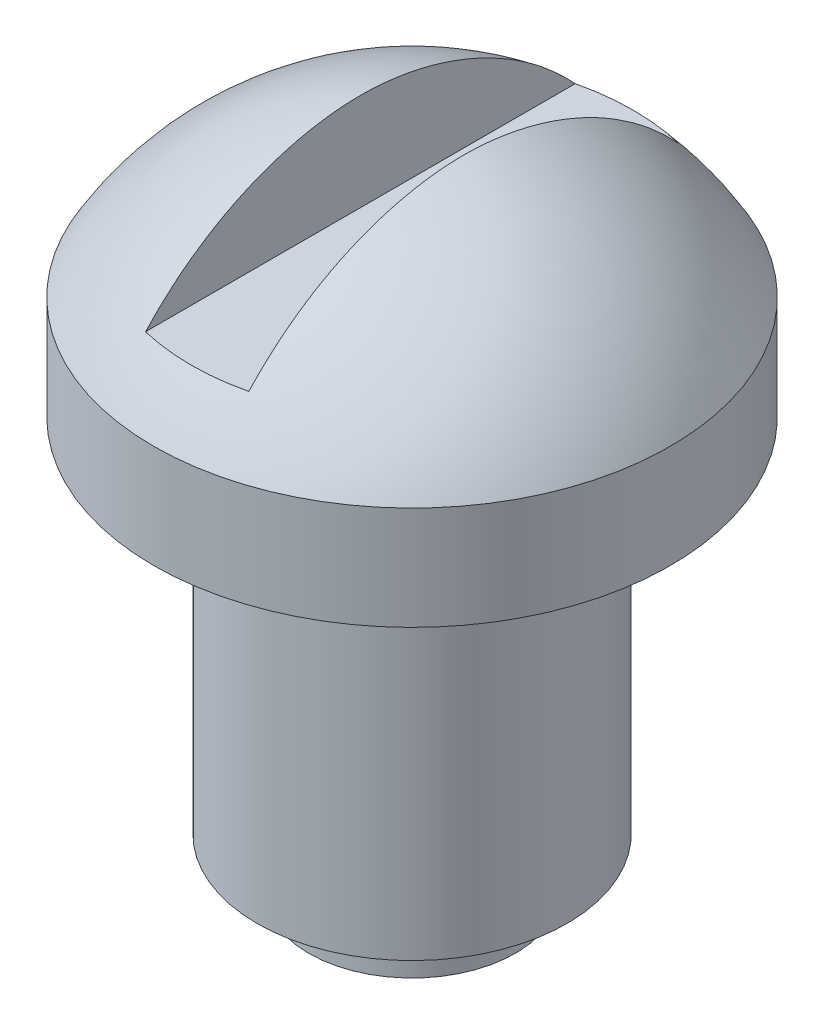
ISO-10303-21;
HEADER;
FILE_DESCRIPTION(('STEP AP214'),'2;1');
FILE_NAME('part.step','',(''),(''),'','','');
FILE_SCHEMA(('AUTOMOTIVE_DESIGN { 1 0 10303 214 1 1 1 1 }'));
ENDSEC;
DATA;
#1=APPLICATION_CONTEXT('core data for automotive mechanical design processes');
#2=APPLICATION_PROTOCOL_DEFINITION('international standard','automotive_design',2000,#1);
#3=PRODUCT_CONTEXT('',#1,'mechanical');
#4=PRODUCT('Part','Part','',(#3));
#5=PRODUCT_RELATED_PRODUCT_CATEGORY('part','',(#4));
#6=PRODUCT_DEFINITION_FORMATION('','',#4);
#7=PRODUCT_DEFINITION_CONTEXT('part definition',#1,'design');
#8=PRODUCT_DEFINITION('design','',#6,#7);
#9=PRODUCT_DEFINITION_SHAPE('','',#8);
#10=(LENGTH_UNIT() NAMED_UNIT(*) SI_UNIT(.MILLI.,.METRE.));
#11=(NAMED_UNIT(*) PLANE_ANGLE_UNIT() SI_UNIT($,.RADIAN.));
#12=(NAMED_UNIT(*) SI_UNIT($,.STERADIAN.) SOLID_ANGLE_UNIT());
#13=UNCERTAINTY_MEASURE_WITH_UNIT(LENGTH_MEASURE(1.E-05),#10,'distance_accuracy_value','');
#14=(GEOMETRIC_REPRESENTATION_CONTEXT(3) GLOBAL_UNCERTAINTY_ASSIGNED_CONTEXT((#13)) GLOBAL_UNIT_ASSIGNED_CONTEXT((#10,
#11,#12)) REPRESENTATION_CONTEXT('',''));
#15=CARTESIAN_POINT('',(0.,0.,0.));
#16=DIRECTION('',(0.,0.,1.));
#17=DIRECTION('',(1.,0.,0.));
#18=AXIS2_PLACEMENT_3D('',#15,#16,#17);
#19=CARTESIAN_POINT('',(0.,-64.4842064058548,0.));
#20=DIRECTION('',(0.,1.,0.));
#21=DIRECTION('',(0.,0.,1.));
#22=AXIS2_PLACEMENT_3D('',#19,#20,#21);
#23=PLANE('',#22);
#24=CARTESIAN_POINT('',(0.,-64.4842064058548,0.));
#25=DIRECTION('',(0.,1.,0.));
#26=DIRECTION('',(0.,0.,1.));
#27=AXIS2_PLACEMENT_3D('',#24,#25,#26);
#28=CIRCLE('',#27,2.00000000000002);
#29=CARTESIAN_POINT('',(0.,-64.4842064058548,2.00000000000002));
#30=VERTEX_POINT('',#29);
#31=EDGE_CURVE('E85',#30,#30,#28,.T.);
#32=ORIENTED_EDGE('',*,*,#31,.F.);
#33=EDGE_LOOP('',(#32));
#34=FACE_BOUND('',#33,.T.);
#35=ADVANCED_FACE('F41',(#34),#23,.F.);
#36=CARTESIAN_POINT('',(0.,49.9801599802218,0.));
#37=DIRECTION('',(0.,1.,0.));
#38=DIRECTION('',(0.,0.,1.));
#39=AXIS2_PLACEMENT_3D('',#36,#37,#38);
#40=CYLINDRICAL_SURFACE('',#39,2.00000000000001);
#41=CARTESIAN_POINT('',(0.,-63.4842064058548,0.));
#42=DIRECTION('',(0.,1.,0.));
#43=DIRECTION('',(0.,0.,1.));
#44=AXIS2_PLACEMENT_3D('',#41,#42,#43);
#45=CIRCLE('',#44,2.00000000000001);
#46=CARTESIAN_POINT('',(0.,-63.4842064058548,2.00000000000001));
#47=VERTEX_POINT('',#46);
#48=EDGE_CURVE('E115',#47,#47,#45,.T.);
#49=ORIENTED_EDGE('',*,*,#48,.F.);
#50=EDGE_LOOP('',(#49));
#51=FACE_BOUND('',#50,.T.);
#52=ORIENTED_EDGE('',*,*,#31,.T.);
#53=EDGE_LOOP('',(#52));
#54=FACE_BOUND('',#53,.T.);
#55=ADVANCED_FACE('F105',(#51,#54),#40,.T.);
#56=CARTESIAN_POINT('',(2.00000000000002,-63.4842064058548,0.));
#57=DIRECTION('',(0.,1.,0.));
#58=DIRECTION('',(0.,0.,1.));
#59=AXIS2_PLACEMENT_3D('',#56,#57,#58);
#60=PLANE('',#59);
#61=CARTESIAN_POINT('',(0.,-63.4842064058548,0.));
#62=DIRECTION('',(0.,1.,0.));
#63=DIRECTION('',(0.,0.,1.));
#64=AXIS2_PLACEMENT_3D('',#61,#62,#63);
#65=CIRCLE('',#64,3.00000000000001);
#66=CARTESIAN_POINT('',(0.,-63.4842064058548,3.00000000000001));
#67=VERTEX_POINT('',#66);
#68=EDGE_CURVE('E117',#67,#67,#65,.T.);
#69=ORIENTED_EDGE('',*,*,#68,.F.);
#70=EDGE_LOOP('',(#69));
#71=FACE_BOUND('',#70,.T.);
#72=ORIENTED_EDGE('',*,*,#48,.T.);
#73=EDGE_LOOP('',(#72));
#74=FACE_BOUND('',#73,.T.);
#75=ADVANCED_FACE('F110',(#71,#74),#60,.F.);
#76=CARTESIAN_POINT('',(0.,49.9801599802218,0.));
#77=DIRECTION('',(0.,1.,0.));
#78=DIRECTION('',(0.,0.,1.));
#79=AXIS2_PLACEMENT_3D('',#76,#77,#78);
#80=CYLINDRICAL_SURFACE('',#79,3.00000000000001);
#81=CARTESIAN_POINT('',(0.,-56.4842064058548,0.));
#82=DIRECTION('',(0.,1.,0.));
#83=DIRECTION('',(0.,0.,1.));
#84=AXIS2_PLACEMENT_3D('',#81,#82,#83);
#85=CIRCLE('',#84,3.00000000000001);
#86=CARTESIAN_POINT('',(0.,-56.4842064058548,3.00000000000001));
#87=VERTEX_POINT('',#86);
#88=EDGE_CURVE('E122',#87,#87,#85,.T.);
#89=ORIENTED_EDGE('',*,*,#88,.F.);
#90=EDGE_LOOP('',(#89));
#91=FACE_BOUND('',#90,.T.);
#92=ORIENTED_EDGE('',*,*,#68,.T.);
#93=EDGE_LOOP('',(#92));
#94=FACE_BOUND('',#93,.T.);
#95=ADVANCED_FACE('F139',(#91,#94),#80,.T.);
#96=CARTESIAN_POINT('',(3.00000000000001,-56.4842064058548,0.));
#97=DIRECTION('',(0.,1.,0.));
#98=DIRECTION('',(0.,0.,1.));
#99=AXIS2_PLACEMENT_3D('',#96,#97,#98);
#100=PLANE('',#99);
#101=CARTESIAN_POINT('',(0.,-56.4842064058548,0.));
#102=DIRECTION('',(0.,1.,0.));
#103=DIRECTION('',(0.,0.,1.));
#104=AXIS2_PLACEMENT_3D('',#101,#102,#103);
#105=CIRCLE('',#104,5.00000000000001);
#106=CARTESIAN_POINT('',(0.,-56.4842064058548,5.00000000000001));
#107=VERTEX_POINT('',#106);
#108=EDGE_CURVE('E125',#107,#107,#105,.T.);
#109=ORIENTED_EDGE('',*,*,#108,.F.);
#110=EDGE_LOOP('',(#109));
#111=FACE_BOUND('',#110,.T.);
#112=ORIENTED_EDGE('',*,*,#88,.T.);
#113=EDGE_LOOP('',(#112));
#114=FACE_BOUND('',#113,.T.);
#115=ADVANCED_FACE('F134',(#111,#114),#100,.F.);
#116=CARTESIAN_POINT('',(0.,49.9801599802218,0.));
#117=DIRECTION('',(0.,1.,0.));
#118=DIRECTION('',(0.,0.,1.));
#119=AXIS2_PLACEMENT_3D('',#116,#117,#118);
#120=CYLINDRICAL_SURFACE('',#119,5.00000000000001);
#121=CARTESIAN_POINT('',(0.,-54.4842064058548,0.));
#122=DIRECTION('',(0.,1.,0.));
#123=DIRECTION('',(0.,0.,1.));
#124=AXIS2_PLACEMENT_3D('',#121,#122,#123);
#125=CIRCLE('',#124,5.00000000000001);
#126=CARTESIAN_POINT('',(0.,-54.4842064058548,5.00000000000001));
#127=VERTEX_POINT('',#126);
#128=EDGE_CURVE('E81',#127,#127,#125,.T.);
#129=ORIENTED_EDGE('',*,*,#128,.F.);
#130=EDGE_LOOP('',(#129));
#131=FACE_BOUND('',#130,.T.);
#132=ORIENTED_EDGE('',*,*,#108,.T.);
#133=EDGE_LOOP('',(#132));
#134=FACE_BOUND('',#133,.T.);
#135=ADVANCED_FACE('F103',(#131,#134),#120,.T.);
#136=CARTESIAN_POINT('',(0.,-57.4809372445079,0.));
#137=DIRECTION('',(0.,1.,0.));
#138=DIRECTION('',(0.,0.,1.));
#139=AXIS2_PLACEMENT_3D('',#136,#137,#138);
#140=DEGENERATE_TOROIDAL_SURFACE('',#139,0.198038503191875,6.,.F.);
#141=CARTESIAN_POINT('',(1.00000000000001,-51.6017618138144,0.));
#142=CARTESIAN_POINT('',(1.00000000000001,-51.6017620033345,0.084715214042042));
#143=CARTESIAN_POINT('',(1.00000000000001,-51.6039620872374,0.169431367941145));
#144=CARTESIAN_POINT('',(1.00000000000001,-51.6126852032767,0.338635647219892));
#145=CARTESIAN_POINT('',(1.00000000000001,-51.6192084272891,0.42312376231126));
#146=CARTESIAN_POINT('',(1.00000000000001,-51.6450022133793,0.67604980028602));
#147=CARTESIAN_POINT('',(1.00000000000001,-51.6704966630048,0.843886011122747));
#148=CARTESIAN_POINT('',(1.00000000000001,-51.7349056765373,1.16718626016063));
#149=CARTESIAN_POINT('',(1.00000000000001,-51.7729928715949,1.32281841748707));
#150=CARTESIAN_POINT('',(1.00000000000001,-51.8620798150541,1.63036838562201));
#151=CARTESIAN_POINT('',(1.00000000000001,-51.9130845178093,1.78228474671147));
#152=CARTESIAN_POINT('',(1.00000000000001,-52.0848335481229,2.23126062415455));
#153=CARTESIAN_POINT('',(1.00000000000001,-52.2242831377964,2.52140116258975));
#154=CARTESIAN_POINT('',(1.00000000000001,-52.5502586771165,3.07783725306508));
#155=CARTESIAN_POINT('',(1.00000000000001,-52.7372668679111,3.34384819548251));
#156=CARTESIAN_POINT('',(1.00000000000001,-53.1523458725852,3.84147886178625));
#157=CARTESIAN_POINT('',(1.00000000000001,-53.3803994449123,4.07311295177832));
#158=CARTESIAN_POINT('',(1.00000000000001,-53.8768780497599,4.50058698561096));
#159=CARTESIAN_POINT('',(1.00000000000002,-54.1460900749164,4.69551335069735));
#160=CARTESIAN_POINT('',(1.00000000000002,-54.7134087000799,5.0375714062977));
#161=CARTESIAN_POINT('',(1.00000000000001,-55.0115207319416,5.18469408924571));
#162=CARTESIAN_POINT('',(1.00000000000001,-55.6289031075391,5.42727476010327));
#163=CARTESIAN_POINT('',(1.00000000000002,-55.9482251905062,5.52260078282719));
#164=CARTESIAN_POINT('',(1.00000000000002,-56.5985012543226,5.65830273067935));
#165=CARTESIAN_POINT('',(1.00000000000001,-56.9294546989123,5.69868118574451));
#166=CARTESIAN_POINT('',(1.00000000000001,-57.427217243753,5.71723650726338));
#167=CARTESIAN_POINT('',(1.00000000000002,-57.5934987684865,5.71640136190316));
#168=CARTESIAN_POINT('',(1.00000000000002,-57.9253847543706,5.70073557668872));
#169=CARTESIAN_POINT('',(1.00000000000002,-58.0909894424208,5.68591009381828));
#170=CARTESIAN_POINT('',(1.00000000000002,-58.4204197928397,5.64235342682744));
#171=CARTESIAN_POINT('',(1.00000000000002,-58.5842446688328,5.61361633273106));
#172=CARTESIAN_POINT('',(1.00000000000002,-58.9088337443682,5.54245436998294));
#173=CARTESIAN_POINT('',(1.00000000000001,-59.0695990518467,5.50003456001177));
#174=CARTESIAN_POINT('',(1.00000000000001,-59.387058630741,5.4017806215291));
#175=CARTESIAN_POINT('',(1.00000000000002,-59.5437509624108,5.34594022665816));
#176=CARTESIAN_POINT('',(1.00000000000002,-59.8518149871753,5.22127480980668));
#177=CARTESIAN_POINT('',(1.00000000000002,-60.0031886251116,5.15245459391785));
#178=CARTESIAN_POINT('',(1.00000000000002,-60.2996334318136,5.00228575249587));
#179=CARTESIAN_POINT('',(1.00000000000002,-60.4447031072029,4.92093417886931));
#180=CARTESIAN_POINT('',(1.00000000000002,-60.7274155936637,4.74632325014781));
#181=CARTESIAN_POINT('',(1.00000000000001,-60.8650611351638,4.65306831590965));
#182=CARTESIAN_POINT('',(1.00000000000001,-61.1319911936666,4.45529471260292));
#183=CARTESIAN_POINT('',(1.00000000000002,-61.2612763457079,4.35077690065216));
#184=CARTESIAN_POINT('',(1.00000000000002,-61.5105263067453,4.13125199759025));
#185=CARTESIAN_POINT('',(1.00000000000002,-61.6304945569077,4.01624881366369));
#186=CARTESIAN_POINT('',(1.00000000000002,-61.8603792320019,3.7764534764499));
#187=CARTESIAN_POINT('',(1.00000000000002,-61.9702889631682,3.6516549056455));
#188=CARTESIAN_POINT('',(1.00000000000002,-62.1791326107265,3.39326595778808));
#189=CARTESIAN_POINT('',(1.00000000000001,-62.278070622081,3.25967889071631));
#190=CARTESIAN_POINT('',(1.00000000000001,-62.4641722763406,2.98479173829538));
#191=CARTESIAN_POINT('',(1.00000000000002,-62.5513509615506,2.84350183764221));
#192=CARTESIAN_POINT('',(1.00000000000002,-62.7133971287968,2.55409979674733));
#193=CARTESIAN_POINT('',(1.00000000000002,-62.7882693228116,2.40599029556921));
#194=CARTESIAN_POINT('',(1.00000000000002,-62.9251541758124,2.10391433004905));
#195=CARTESIAN_POINT('',(1.00000000000002,-62.9871648852885,1.94994698196975));
#196=CARTESIAN_POINT('',(1.00000000000002,-63.0977460255027,1.63722122251093));
#197=CARTESIAN_POINT('',(1.00000000000001,-63.1463141514324,1.47846199470478));
#198=CARTESIAN_POINT('',(1.00000000000001,-63.2290084018886,1.15867481923666));
#199=CARTESIAN_POINT('',(1.00000000000002,-63.2632547001506,0.997677964611161));
#200=CARTESIAN_POINT('',(1.00000000000002,-63.3169983056576,0.673232832934111));
#201=CARTESIAN_POINT('',(1.00000000000002,-63.3365003035741,0.509785352401461));
#202=CARTESIAN_POINT('',(1.00000000000002,-63.3537033509096,0.263902349028015));
#203=CARTESIAN_POINT('',(1.00000000000002,-63.3574303787634,0.181858872462155));
#204=CARTESIAN_POINT('',(1.00000000000002,-63.3607670673409,0.0176888281661727));
#205=CARTESIAN_POINT('',(1.00000000000002,-63.360376764804,-0.0644377388159857));
#206=CARTESIAN_POINT('',(1.00000000000002,-63.3530285662734,-0.310631746336618));
#207=CARTESIAN_POINT('',(1.00000000000001,-63.3398960307316,-0.474551187303378));
#208=CARTESIAN_POINT('',(1.00000000000001,-63.3007565972144,-0.781882296115757));
#209=CARTESIAN_POINT('',(1.00000000000002,-63.2763789343778,-0.925511188845437));
#210=CARTESIAN_POINT('',(1.00000000000002,-63.2164542721358,-1.21041404290608));
#211=CARTESIAN_POINT('',(1.00000000000002,-63.1809077418449,-1.3516881028823));
#212=CARTESIAN_POINT('',(1.00000000000002,-63.0990945589699,-1.63129077178507));
#213=CARTESIAN_POINT('',(1.00000000000002,-63.0528138910334,-1.76961526943501));
#214=CARTESIAN_POINT('',(1.00000000000002,-62.9499718467737,-2.04238346203414));
#215=CARTESIAN_POINT('',(1.00000000000001,-62.8934104444407,-2.17682714716407));
#216=CARTESIAN_POINT('',(1.00000000000001,-62.7648827921542,-2.45295167812796));
#217=CARTESIAN_POINT('',(1.00000000000002,-62.6919906030393,-2.59420244098579));
#218=CARTESIAN_POINT('',(1.00000000000002,-62.5349657048835,-2.87037584762266));
#219=CARTESIAN_POINT('',(1.00000000000002,-62.4508288180445,-3.00529611410714));
#220=CARTESIAN_POINT('',(1.00000000000002,-62.2719941515594,-3.26776765325747));
#221=CARTESIAN_POINT('',(1.00000000000002,-62.1773059957909,-3.39532548260354));
#222=CARTESIAN_POINT('',(1.00000000000002,-61.9779062220619,-3.6424253283467));
#223=CARTESIAN_POINT('',(1.00000000000001,-61.8731909083814,-3.76196436142887));
#224=CARTESIAN_POINT('',(1.00000000000001,-61.6500460155144,-3.9968469315779));
#225=CARTESIAN_POINT('',(1.00000000000002,-61.5312338489194,-4.11182732770429));
#226=CARTESIAN_POINT('',(1.00000000000002,-61.284339024931,-4.33145883799657));
#227=CARTESIAN_POINT('',(1.00000000000002,-61.1562528478043,-4.43610599442872));
#228=CARTESIAN_POINT('',(1.00000000000002,-60.8917545312829,-4.63429076865995));
#229=CARTESIAN_POINT('',(1.00000000000002,-60.7553423380975,-4.72782831467319));
#230=CARTESIAN_POINT('',(1.00000000000002,-60.4751045633243,-4.9031697876381));
#231=CARTESIAN_POINT('',(1.00000000000001,-60.3312762554568,-4.98496935711588));
#232=CARTESIAN_POINT('',(1.00000000000001,-60.0366988816172,-5.13651256223437));
#233=CARTESIAN_POINT('',(1.00000000000002,-59.8859252314416,-5.20620841466713));
#234=CARTESIAN_POINT('',(1.00000000000002,-59.5789906486952,-5.33268683649817));
#235=CARTESIAN_POINT('',(1.00000000000002,-59.4228277477565,-5.38946462897187));
#236=CARTESIAN_POINT('',(1.00000000000002,-59.106349214222,-5.48964948260917));
#237=CARTESIAN_POINT('',(1.00000000000002,-58.9460355181701,-5.53306266134834));
#238=CARTESIAN_POINT('',(1.00000000000002,-58.6222675802018,-5.60625938881528));
#239=CARTESIAN_POINT('',(1.00000000000001,-58.4588122652691,-5.63603819133537));
#240=CARTESIAN_POINT('',(1.00000000000001,-58.1298476886274,-5.68175099955457));
#241=CARTESIAN_POINT('',(1.00000000000002,-57.9643369323172,-5.69767425018369));
#242=CARTESIAN_POINT('',(1.00000000000002,-57.6325623617687,-5.7155238871807));
#243=CARTESIAN_POINT('',(1.00000000000002,-57.4662985472138,-5.7174502676619));
#244=CARTESIAN_POINT('',(1.00000000000002,-57.1341674561535,-5.70729151944554));
#245=CARTESIAN_POINT('',(1.00000000000002,-56.9683002620438,-5.69520369647299));
#246=CARTESIAN_POINT('',(1.00000000000002,-56.6382312951154,-5.65710445092511));
#247=CARTESIAN_POINT('',(1.00000000000001,-56.4740289632688,-5.63109787116813));
#248=CARTESIAN_POINT('',(1.00000000000001,-56.1483168565421,-5.56533199262311));
#249=CARTESIAN_POINT('',(1.00000000000002,-55.986808459442,-5.52556586986942));
#250=CARTESIAN_POINT('',(1.00000000000002,-55.6677757862536,-5.4325826602569));
#251=CARTESIAN_POINT('',(1.00000000000002,-55.5102500658004,-5.379370529019));
#252=CARTESIAN_POINT('',(1.00000000000002,-55.2001741345772,-5.25983909791052));
#253=CARTESIAN_POINT('',(1.00000000000002,-55.0476261052788,-5.19351413889414));
#254=CARTESIAN_POINT('',(1.00000000000002,-54.7487188602767,-5.04826866594178));
#255=CARTESIAN_POINT('',(1.00000000000001,-54.6023573772014,-4.96935281809966));
#256=CARTESIAN_POINT('',(1.00000000000001,-54.3167670774781,-4.79944382576311));
#257=CARTESIAN_POINT('',(1.00000000000002,-54.1775402044198,-4.70844741430342));
#258=CARTESIAN_POINT('',(1.00000000000002,-53.9073055495624,-4.51507434921619));
#259=CARTESIAN_POINT('',(1.00000000000002,-53.776294740615,-4.41270192599234));
#260=CARTESIAN_POINT('',(1.00000000000002,-53.5233633444713,-4.19726618210048));
#261=CARTESIAN_POINT('',(1.00000000000002,-53.4014434039541,-4.08420210217641));
#262=CARTESIAN_POINT('',(1.00000000000002,-53.1676224244478,-3.84823303538729));
#263=CARTESIAN_POINT('',(1.00000000000001,-53.0557176688521,-3.72533173143076));
#264=CARTESIAN_POINT('',(1.00000000000001,-52.8427997086127,-3.47065867298169));
#265=CARTESIAN_POINT('',(1.00000000000001,-52.7417747747898,-3.33889672501088));
#266=CARTESIAN_POINT('',(1.00000000000001,-52.5512492193091,-3.06736210870641));
#267=CARTESIAN_POINT('',(1.00000000000001,-52.4617442729835,-2.92759247514661));
#268=CARTESIAN_POINT('',(1.00000000000001,-52.2947614993834,-2.64077164373698));
#269=CARTESIAN_POINT('',(1.00000000000001,-52.2173012951155,-2.49371018400325));
#270=CARTESIAN_POINT('',(1.00000000000001,-52.075178544745,-2.19353250997935));
#271=CARTESIAN_POINT('',(1.00000000000001,-52.0105154444765,-2.04041655821763));
#272=CARTESIAN_POINT('',(1.00000000000001,-51.896380084506,-1.73407724863787));
#273=CARTESIAN_POINT('',(1.00000000000001,-51.8464952711916,-1.5810076332184));
#274=CARTESIAN_POINT('',(1.00000000000001,-51.7598214831575,-1.27117461313799));
#275=CARTESIAN_POINT('',(1.00000000000001,-51.7230346939366,-1.11441059668814));
#276=CARTESIAN_POINT('',(1.00000000000001,-51.6634039282768,-0.798698968899816));
#277=CARTESIAN_POINT('',(1.00000000000001,-51.6405176379582,-0.639759505708921));
#278=CARTESIAN_POINT('',(1.00000000000001,-51.6173865387156,-0.400349049856903));
#279=CARTESIAN_POINT('',(1.00000000000001,-51.6115425994306,-0.320390928379088));
#280=CARTESIAN_POINT('',(1.00000000000001,-51.6037303837037,-0.1602888024163));
#281=CARTESIAN_POINT('',(1.00000000000001,-51.6017616345189,-0.0801448217990995));
#282=CARTESIAN_POINT('',(1.00000000000001,-51.6017618138144,0.));
#283=B_SPLINE_CURVE_WITH_KNOTS('',3,(#141,#142,#143,#144,#145,#146,#147,#148,#149,#150,#151,
#152,#153,#154,#155,#156,#157,#158,#159,#160,#161,#162,#163,#164,#165,#166,#167,#168,#169,#170,
#171,#172,#173,#174,#175,#176,#177,#178,#179,#180,#181,#182,#183,#184,#185,#186,#187,#188,#189,
#190,#191,#192,#193,#194,#195,#196,#197,#198,#199,#200,#201,#202,#203,#204,#205,#206,#207,#208,
#209,#210,#211,#212,#213,#214,#215,#216,#217,#218,#219,#220,#221,#222,#223,#224,#225,#226,#227,
#228,#229,#230,#231,#232,#233,#234,#235,#236,#237,#238,#239,#240,#241,#242,#243,#244,#245,#246,
#247,#248,#249,#250,#251,#252,#253,#254,#255,#256,#257,#258,#259,#260,#261,#262,#263,#264,#265,
#266,#267,#268,#269,#270,#271,#272,#273,#274,#275,#276,#277,#278,#279,#280,#281,#282),
.UNSPECIFIED.,.T.,.F.,(4,2,2,2,2,2,2,2,2,2,2,2,2,2,2,2,2,2,2,2,2,2,2,2,2,2,2,2,2,2,2,2,2,2,2,2,
2,2,2,2,2,2,2,2,2,2,2,2,2,2,2,2,2,2,2,2,2,2,2,2,2,2,2,2,2,2,2,2,2,2,4),(0.,0.25411636196147,
0.508244003242231,1.01668865019979,1.4967887856993,1.97707333738981,2.93808324243028,
3.90925590074127,4.8800215556691,5.87243907252414,6.86504348061431,7.86016508290717,
8.85524086551802,9.35360700331939,9.85178950991183,10.3501838419909,10.8483941219075,
11.3468374803963,11.845096639265,12.3434731967689,12.8416651950142,13.3398193070197,
13.8377885436906,14.3360867962232,14.8341984390456,15.3316667389482,15.8289441194407,
16.3262968209258,16.8237347436439,17.3169106151739,17.8099295243187,18.0562229358765,
18.3025141497307,18.7949837399267,19.2315947344533,19.6681873929024,20.1053533432303,
20.5425203995837,21.0188367932417,21.495330649612,21.9713933964882,22.4476322866668,
22.9430608596616,23.438678456642,23.9342992559297,24.4301035705265,24.9278228043741,
25.425725790033,25.9234005233899,26.421248368819,26.9194823139273,27.4177164685789,
27.9160464262109,28.4142031101739,28.9126072070127,29.4108278807598,29.9092640444475,
30.4075159184667,30.9059028110233,31.4041049845019,31.9023425638581,32.4003944753036,
32.8979039618989,33.395226132486,33.8932692380587,34.3912907716458,34.8737050042678,
35.3561996934684,35.8372181835452,36.0776542815888,36.3180610464886),.UNSPECIFIED.);
#284=CARTESIAN_POINT('',(1.00000000000001,-53.4842064058548,-4.15847259729493));
#285=VERTEX_POINT('',#284);
#286=CARTESIAN_POINT('',(1.00000000000001,-53.4842064058548,4.15847259729493));
#287=VERTEX_POINT('',#286);
#288=EDGE_CURVE('E79',#285,#287,#283,.T.);
#289=ORIENTED_EDGE('',*,*,#288,.T.);
#290=CARTESIAN_POINT('',(0.,-53.4842064058548,0.));
#291=DIRECTION('',(0.,-1.,0.));
#292=DIRECTION('',(0.,0.,-1.));
#293=AXIS2_PLACEMENT_3D('',#290,#291,#292);
#294=CIRCLE('',#293,4.27701932921198);
#295=CARTESIAN_POINT('',(-1.00000000000001,-53.4842064058548,4.15847259729493));
#296=VERTEX_POINT('',#295);
#297=EDGE_CURVE('E11',#287,#296,#294,.T.);
#298=ORIENTED_EDGE('',*,*,#297,.T.);
#299=CARTESIAN_POINT('',(-1.00000000000001,-51.6017618138144,0.));
#300=CARTESIAN_POINT('',(-1.00000000000001,-51.6017620033345,-0.084715214042042));
#301=CARTESIAN_POINT('',(-1.00000000000001,-51.6039620872374,-0.169431367941145));
#302=CARTESIAN_POINT('',(-1.00000000000001,-51.6126852032767,-0.338635647219892));
#303=CARTESIAN_POINT('',(-1.00000000000001,-51.6192084272891,-0.42312376231126));
#304=CARTESIAN_POINT('',(-1.00000000000001,-51.6450022133793,-0.67604980028602));
#305=CARTESIAN_POINT('',(-1.00000000000001,-51.6704966630048,-0.843886011122747));
#306=CARTESIAN_POINT('',(-1.00000000000001,-51.7349056765373,-1.16718626016063));
#307=CARTESIAN_POINT('',(-1.00000000000001,-51.7729928715949,-1.32281841748707));
#308=CARTESIAN_POINT('',(-1.00000000000001,-51.8620798150541,-1.63036838562201));
#309=CARTESIAN_POINT('',(-1.00000000000001,-51.9130845178093,-1.78228474671147));
#310=CARTESIAN_POINT('',(-1.00000000000001,-52.0848335481229,-2.23126062415455));
#311=CARTESIAN_POINT('',(-1.00000000000001,-52.2242831377964,-2.52140116258975));
#312=CARTESIAN_POINT('',(-1.00000000000002,-52.5502586771165,-3.07783725306508));
#313=CARTESIAN_POINT('',(-1.00000000000002,-52.7372668679111,-3.34384819548251));
#314=CARTESIAN_POINT('',(-1.00000000000001,-53.1523458725852,-3.84147886178625));
#315=CARTESIAN_POINT('',(-1.00000000000001,-53.3803994449123,-4.07311295177832));
#316=CARTESIAN_POINT('',(-1.00000000000001,-53.8768780497599,-4.50058698561096));
#317=CARTESIAN_POINT('',(-1.00000000000001,-54.1460900749164,-4.69551335069735));
#318=CARTESIAN_POINT('',(-1.00000000000001,-54.7134087000799,-5.03757140629771));
#319=CARTESIAN_POINT('',(-1.00000000000001,-55.0115207319416,-5.18469408924571));
#320=CARTESIAN_POINT('',(-1.00000000000001,-55.6289031075391,-5.42727476010327));
#321=CARTESIAN_POINT('',(-1.00000000000001,-55.9482251905062,-5.52260078282719));
#322=CARTESIAN_POINT('',(-1.00000000000001,-56.5985012543226,-5.65830273067935));
#323=CARTESIAN_POINT('',(-1.00000000000001,-56.9294546989123,-5.69868118574451));
#324=CARTESIAN_POINT('',(-1.00000000000001,-57.427217243753,-5.71723650726338));
#325=CARTESIAN_POINT('',(-1.00000000000001,-57.5934987684865,-5.71640136190316));
#326=CARTESIAN_POINT('',(-1.00000000000001,-57.9253847543706,-5.70073557668872));
#327=CARTESIAN_POINT('',(-1.00000000000001,-58.0909894424208,-5.68591009381828));
#328=CARTESIAN_POINT('',(-1.00000000000001,-58.4204197928397,-5.64235342682744));
#329=CARTESIAN_POINT('',(-1.00000000000001,-58.5842446688328,-5.61361633273106));
#330=CARTESIAN_POINT('',(-1.00000000000001,-58.9088337443682,-5.54245436998294));
#331=CARTESIAN_POINT('',(-1.00000000000001,-59.0695990518467,-5.50003456001177));
#332=CARTESIAN_POINT('',(-1.00000000000001,-59.387058630741,-5.4017806215291));
#333=CARTESIAN_POINT('',(-1.00000000000001,-59.5437509624108,-5.34594022665816));
#334=CARTESIAN_POINT('',(-1.00000000000001,-59.8518149871753,-5.22127480980668));
#335=CARTESIAN_POINT('',(-1.00000000000001,-60.0031886251116,-5.15245459391785));
#336=CARTESIAN_POINT('',(-1.00000000000001,-60.2996334318136,-5.00228575249587));
#337=CARTESIAN_POINT('',(-1.00000000000001,-60.4447031072029,-4.92093417886931));
#338=CARTESIAN_POINT('',(-1.00000000000001,-60.7274155936637,-4.74632325014781));
#339=CARTESIAN_POINT('',(-1.00000000000001,-60.8650611351638,-4.65306831590966));
#340=CARTESIAN_POINT('',(-1.00000000000001,-61.1319911936666,-4.45529471260293));
#341=CARTESIAN_POINT('',(-1.00000000000001,-61.2612763457079,-4.35077690065217));
#342=CARTESIAN_POINT('',(-1.00000000000001,-61.5105263067453,-4.13125199759025));
#343=CARTESIAN_POINT('',(-1.00000000000001,-61.6304945569077,-4.0162488136637));
#344=CARTESIAN_POINT('',(-1.00000000000001,-61.8603792320019,-3.77645347644991));
#345=CARTESIAN_POINT('',(-1.00000000000001,-61.9702889631682,-3.65165490564551));
#346=CARTESIAN_POINT('',(-1.00000000000001,-62.1791326107265,-3.39326595778809));
#347=CARTESIAN_POINT('',(-1.00000000000001,-62.278070622081,-3.25967889071631));
#348=CARTESIAN_POINT('',(-1.00000000000001,-62.4641722763406,-2.98479173829538));
#349=CARTESIAN_POINT('',(-1.00000000000001,-62.5513509615506,-2.8435018376422));
#350=CARTESIAN_POINT('',(-1.00000000000001,-62.7133971287968,-2.55409979674732));
#351=CARTESIAN_POINT('',(-1.00000000000001,-62.7882693228116,-2.4059902955692));
#352=CARTESIAN_POINT('',(-1.00000000000001,-62.9251541758124,-2.10391433004904));
#353=CARTESIAN_POINT('',(-1.00000000000001,-62.9871648852886,-1.94994698196974));
#354=CARTESIAN_POINT('',(-1.00000000000001,-63.0977460255027,-1.63722122251092));
#355=CARTESIAN_POINT('',(-1.00000000000001,-63.1463141514324,-1.47846199470478));
#356=CARTESIAN_POINT('',(-1.00000000000001,-63.2290084018886,-1.15867481923666));
#357=CARTESIAN_POINT('',(-1.00000000000001,-63.2632547001507,-0.997677964611159));
#358=CARTESIAN_POINT('',(-1.00000000000001,-63.3169983056576,-0.67323283293411));
#359=CARTESIAN_POINT('',(-1.00000000000001,-63.3365003035741,-0.509785352401463));
#360=CARTESIAN_POINT('',(-1.00000000000001,-63.3537033509096,-0.263902349028017));
#361=CARTESIAN_POINT('',(-1.00000000000001,-63.3574303787634,-0.181858872462156));
#362=CARTESIAN_POINT('',(-1.00000000000001,-63.3607670673409,-0.0176888281661722));
#363=CARTESIAN_POINT('',(-1.00000000000001,-63.360376764804,0.0644377388159862));
#364=CARTESIAN_POINT('',(-1.00000000000001,-63.3530285662734,0.310631746336619));
#365=CARTESIAN_POINT('',(-1.00000000000001,-63.3398960307316,0.474551187303378));
#366=CARTESIAN_POINT('',(-1.00000000000001,-63.3007565972144,0.781882296115758));
#367=CARTESIAN_POINT('',(-1.00000000000001,-63.2763789343778,0.925511188845438));
#368=CARTESIAN_POINT('',(-1.00000000000001,-63.2164542721358,1.21041404290608));
#369=CARTESIAN_POINT('',(-1.00000000000001,-63.1809077418449,1.35168810288231));
#370=CARTESIAN_POINT('',(-1.00000000000001,-63.0990945589699,1.63129077178507));
#371=CARTESIAN_POINT('',(-1.00000000000001,-63.0528138910334,1.76961526943501));
#372=CARTESIAN_POINT('',(-1.00000000000001,-62.9499718467737,2.04238346203415));
#373=CARTESIAN_POINT('',(-1.00000000000001,-62.8934104444407,2.17682714716407));
#374=CARTESIAN_POINT('',(-1.00000000000001,-62.7648827921542,2.45295167812796));
#375=CARTESIAN_POINT('',(-1.00000000000001,-62.6919906030393,2.59420244098579));
#376=CARTESIAN_POINT('',(-1.00000000000001,-62.5349657048835,2.87037584762266));
#377=CARTESIAN_POINT('',(-1.00000000000001,-62.4508288180445,3.00529611410714));
#378=CARTESIAN_POINT('',(-1.00000000000001,-62.2719941515594,3.26776765325747));
#379=CARTESIAN_POINT('',(-1.00000000000001,-62.1773059957909,3.39532548260354));
#380=CARTESIAN_POINT('',(-1.00000000000001,-61.9779062220619,3.6424253283467));
#381=CARTESIAN_POINT('',(-1.00000000000001,-61.8731909083814,3.76196436142887));
#382=CARTESIAN_POINT('',(-1.00000000000001,-61.6500460155144,3.9968469315779));
#383=CARTESIAN_POINT('',(-1.00000000000001,-61.5312338489194,4.1118273277043));
#384=CARTESIAN_POINT('',(-1.00000000000001,-61.284339024931,4.33145883799657));
#385=CARTESIAN_POINT('',(-1.00000000000001,-61.1562528478043,4.43610599442872));
#386=CARTESIAN_POINT('',(-1.00000000000001,-60.8917545312829,4.63429076865995));
#387=CARTESIAN_POINT('',(-1.00000000000001,-60.7553423380975,4.7278283146732));
#388=CARTESIAN_POINT('',(-1.00000000000001,-60.4751045633243,4.9031697876381));
#389=CARTESIAN_POINT('',(-1.00000000000001,-60.3312762554568,4.98496935711588));
#390=CARTESIAN_POINT('',(-1.00000000000001,-60.0366988816172,5.13651256223436));
#391=CARTESIAN_POINT('',(-1.00000000000001,-59.8859252314416,5.20620841466712));
#392=CARTESIAN_POINT('',(-1.00000000000001,-59.5789906486952,5.33268683649816));
#393=CARTESIAN_POINT('',(-1.00000000000001,-59.4228277477565,5.38946462897187));
#394=CARTESIAN_POINT('',(-1.00000000000001,-59.106349214222,5.48964948260918));
#395=CARTESIAN_POINT('',(-1.00000000000001,-58.9460355181701,5.53306266134834));
#396=CARTESIAN_POINT('',(-1.00000000000001,-58.6222675802018,5.60625938881528));
#397=CARTESIAN_POINT('',(-1.00000000000001,-58.4588122652691,5.63603819133538));
#398=CARTESIAN_POINT('',(-1.00000000000001,-58.1298476886274,5.68175099955457));
#399=CARTESIAN_POINT('',(-1.00000000000001,-57.9643369323172,5.69767425018369));
#400=CARTESIAN_POINT('',(-1.00000000000001,-57.6325623617687,5.7155238871807));
#401=CARTESIAN_POINT('',(-1.00000000000001,-57.4662985472138,5.7174502676619));
#402=CARTESIAN_POINT('',(-1.00000000000001,-57.1341674561535,5.70729151944554));
#403=CARTESIAN_POINT('',(-1.00000000000002,-56.9683002620438,5.69520369647299));
#404=CARTESIAN_POINT('',(-1.00000000000001,-56.6382312951154,5.65710445092511));
#405=CARTESIAN_POINT('',(-1.00000000000001,-56.4740289632688,5.63109787116813));
#406=CARTESIAN_POINT('',(-1.00000000000001,-56.1483168565421,5.56533199262311));
#407=CARTESIAN_POINT('',(-1.00000000000001,-55.986808459442,5.52556586986942));
#408=CARTESIAN_POINT('',(-1.00000000000002,-55.6677757862536,5.4325826602569));
#409=CARTESIAN_POINT('',(-1.00000000000001,-55.5102500658004,5.379370529019));
#410=CARTESIAN_POINT('',(-1.00000000000001,-55.2001741345772,5.25983909791052));
#411=CARTESIAN_POINT('',(-1.00000000000002,-55.0476261052788,5.19351413889414));
#412=CARTESIAN_POINT('',(-1.00000000000001,-54.7487188602767,5.04826866594178));
#413=CARTESIAN_POINT('',(-1.00000000000001,-54.6023573772014,4.96935281809966));
#414=CARTESIAN_POINT('',(-1.00000000000001,-54.3167670774781,4.79944382576311));
#415=CARTESIAN_POINT('',(-1.00000000000001,-54.1775402044198,4.70844741430342));
#416=CARTESIAN_POINT('',(-1.00000000000002,-53.9073055495624,4.5150743492162));
#417=CARTESIAN_POINT('',(-1.00000000000001,-53.776294740615,4.41270192599235));
#418=CARTESIAN_POINT('',(-1.00000000000001,-53.5233633444713,4.19726618210048));
#419=CARTESIAN_POINT('',(-1.00000000000001,-53.4014434039541,4.08420210217642));
#420=CARTESIAN_POINT('',(-1.00000000000001,-53.1676224244478,3.8482330353873));
#421=CARTESIAN_POINT('',(-1.00000000000001,-53.0557176688521,3.72533173143077));
#422=CARTESIAN_POINT('',(-1.00000000000001,-52.8427997086127,3.47065867298171));
#423=CARTESIAN_POINT('',(-1.00000000000001,-52.7417747747898,3.33889672501089));
#424=CARTESIAN_POINT('',(-1.00000000000001,-52.5512492193092,3.06736210870642));
#425=CARTESIAN_POINT('',(-1.00000000000001,-52.4617442729835,2.92759247514662));
#426=CARTESIAN_POINT('',(-1.00000000000001,-52.2947614993834,2.64077164373698));
#427=CARTESIAN_POINT('',(-1.00000000000001,-52.2173012951155,2.49371018400326));
#428=CARTESIAN_POINT('',(-1.00000000000001,-52.075178544745,2.19353250997935));
#429=CARTESIAN_POINT('',(-1.00000000000001,-52.0105154444765,2.04041655821763));
#430=CARTESIAN_POINT('',(-1.00000000000001,-51.896380084506,1.73407724863787));
#431=CARTESIAN_POINT('',(-1.00000000000001,-51.8464952711916,1.5810076332184));
#432=CARTESIAN_POINT('',(-1.00000000000001,-51.7598214831575,1.27117461313799));
#433=CARTESIAN_POINT('',(-1.00000000000001,-51.7230346939366,1.11441059668814));
#434=CARTESIAN_POINT('',(-1.00000000000001,-51.6634039282768,0.798698968899816));
#435=CARTESIAN_POINT('',(-1.00000000000001,-51.6405176379582,0.639759505708921));
#436=CARTESIAN_POINT('',(-1.00000000000001,-51.6173865387156,0.400349049856903));
#437=CARTESIAN_POINT('',(-1.00000000000001,-51.6115425994306,0.320390928379088));
#438=CARTESIAN_POINT('',(-1.00000000000001,-51.6037303837037,0.1602888024163));
#439=CARTESIAN_POINT('',(-1.00000000000001,-51.6017616345189,0.0801448217990994));
#440=CARTESIAN_POINT('',(-1.00000000000001,-51.6017618138144,0.));
#441=B_SPLINE_CURVE_WITH_KNOTS('',3,(#299,#300,#301,#302,#303,#304,#305,#306,#307,#308,#309,
#310,#311,#312,#313,#314,#315,#316,#317,#318,#319,#320,#321,#322,#323,#324,#325,#326,#327,#328,
#329,#330,#331,#332,#333,#334,#335,#336,#337,#338,#339,#340,#341,#342,#343,#344,#345,#346,#347,
#348,#349,#350,#351,#352,#353,#354,#355,#356,#357,#358,#359,#360,#361,#362,#363,#364,#365,#366,
#367,#368,#369,#370,#371,#372,#373,#374,#375,#376,#377,#378,#379,#380,#381,#382,#383,#384,#385,
#386,#387,#388,#389,#390,#391,#392,#393,#394,#395,#396,#397,#398,#399,#400,#401,#402,#403,#404,
#405,#406,#407,#408,#409,#410,#411,#412,#413,#414,#415,#416,#417,#418,#419,#420,#421,#422,#423,
#424,#425,#426,#427,#428,#429,#430,#431,#432,#433,#434,#435,#436,#437,#438,#439,#440),
.UNSPECIFIED.,.T.,.F.,(4,2,2,2,2,2,2,2,2,2,2,2,2,2,2,2,2,2,2,2,2,2,2,2,2,2,2,2,2,2,2,2,2,2,2,2,
2,2,2,2,2,2,2,2,2,2,2,2,2,2,2,2,2,2,2,2,2,2,2,2,2,2,2,2,2,2,2,2,2,2,4),(0.,0.25411636196147,
0.508244003242231,1.01668865019979,1.4967887856993,1.97707333738981,2.93808324243028,
3.90925590074126,4.8800215556691,5.87243907252414,6.86504348061432,7.86016508290717,
8.85524086551802,9.35360700331939,9.85178950991183,10.3501838419909,10.8483941219075,
11.3468374803963,11.845096639265,12.3434731967689,12.8416651950142,13.3398193070197,
13.8377885436906,14.3360867962232,14.8341984390456,15.3316667389483,15.8289441194408,
16.3262968209258,16.8237347436439,17.3169106151739,17.8099295243187,18.0562229358765,
18.3025141497308,18.7949837399267,19.2315947344533,19.6681873929024,20.1053533432303,
20.5425203995837,21.0188367932417,21.495330649612,21.9713933964882,22.4476322866668,
22.9430608596616,23.438678456642,23.9342992559297,24.4301035705265,24.9278228043741,
25.425725790033,25.9234005233899,26.421248368819,26.9194823139273,27.4177164685789,
27.9160464262109,28.4142031101739,28.9126072070128,29.4108278807599,29.9092640444475,
30.4075159184667,30.9059028110233,31.4041049845019,31.9023425638581,32.4003944753036,
32.8979039618989,33.395226132486,33.8932692380587,34.3912907716459,34.8737050042678,
35.3561996934684,35.8372181835453,36.0776542815888,36.3180610464886),.UNSPECIFIED.);
#442=CARTESIAN_POINT('',(-1.00000000000001,-53.4842064058548,-4.15847259729493));
#443=VERTEX_POINT('',#442);
#444=EDGE_CURVE('E44',#296,#443,#441,.T.);
#445=ORIENTED_EDGE('',*,*,#444,.T.);
#446=EDGE_CURVE('E55',#443,#285,#294,.T.);
#447=ORIENTED_EDGE('',*,*,#446,.T.);
#448=EDGE_LOOP('',(#289,#298,#445,#447));
#449=FACE_BOUND('',#448,.T.);
#450=ORIENTED_EDGE('',*,*,#128,.T.);
#451=EDGE_LOOP('',(#450));
#452=FACE_BOUND('',#451,.T.);
#453=ADVANCED_FACE('F83',(#449,#452),#140,.F.);
#454=CARTESIAN_POINT('',(-1.00000000000001,-51.4842064058548,-5.));
#455=DIRECTION('',(-1.,0.,0.));
#456=DIRECTION('',(0.,-1.,0.));
#457=AXIS2_PLACEMENT_3D('',#454,#455,#456);
#458=PLANE('',#457);
#459=DIRECTION('',(0.,0.,1.));
#460=VECTOR('',#459,1.);
#461=CARTESIAN_POINT('',(-1.00000000000001,-53.4842064058548,-5.));
#462=LINE('',#461,#460);
#463=EDGE_CURVE('E74',#443,#296,#462,.T.);
#464=ORIENTED_EDGE('',*,*,#463,.F.);
#465=ORIENTED_EDGE('',*,*,#444,.F.);
#466=EDGE_LOOP('',(#464,#465));
#467=FACE_BOUND('',#466,.T.);
#468=ADVANCED_FACE('F96',(#467),#458,.F.);
#469=CARTESIAN_POINT('',(1.00000000000001,-51.4842064058548,-5.));
#470=DIRECTION('',(1.,0.,0.));
#471=DIRECTION('',(0.,1.,0.));
#472=AXIS2_PLACEMENT_3D('',#469,#470,#471);
#473=PLANE('',#472);
#474=DIRECTION('',(0.,0.,1.));
#475=VECTOR('',#474,1.);
#476=CARTESIAN_POINT('',(1.00000000000001,-53.4842064058548,-5.));
#477=LINE('',#476,#475);
#478=EDGE_CURVE('E62',#285,#287,#477,.T.);
#479=ORIENTED_EDGE('',*,*,#478,.T.);
#480=ORIENTED_EDGE('',*,*,#288,.F.);
#481=EDGE_LOOP('',(#479,#480));
#482=FACE_BOUND('',#481,.T.);
#483=ADVANCED_FACE('F78',(#482),#473,.F.);
#484=CARTESIAN_POINT('',(-1.00000000000001,-53.4842064058548,-5.));
#485=DIRECTION('',(0.,-1.,0.));
#486=DIRECTION('',(0.,0.,-1.));
#487=AXIS2_PLACEMENT_3D('',#484,#485,#486);
#488=PLANE('',#487);
#489=ORIENTED_EDGE('',*,*,#478,.F.);
#490=ORIENTED_EDGE('',*,*,#446,.F.);
#491=ORIENTED_EDGE('',*,*,#463,.T.);
#492=ORIENTED_EDGE('',*,*,#297,.F.);
#493=EDGE_LOOP('',(#489,#490,#491,#492));
#494=FACE_BOUND('',#493,.T.);
#495=ADVANCED_FACE('F73',(#494),#488,.F.);
#496=CLOSED_SHELL('',(#35,#55,#75,#95,#115,#135,#453,#468,#483,#495));
#497=MANIFOLD_SOLID_BREP('B2',#496);
#498=ADVANCED_BREP_SHAPE_REPRESENTATION('',(#18,#497),#14);
#499=SHAPE_DEFINITION_REPRESENTATION(#9,#498);
ENDSEC;
END-ISO-10303-21;
